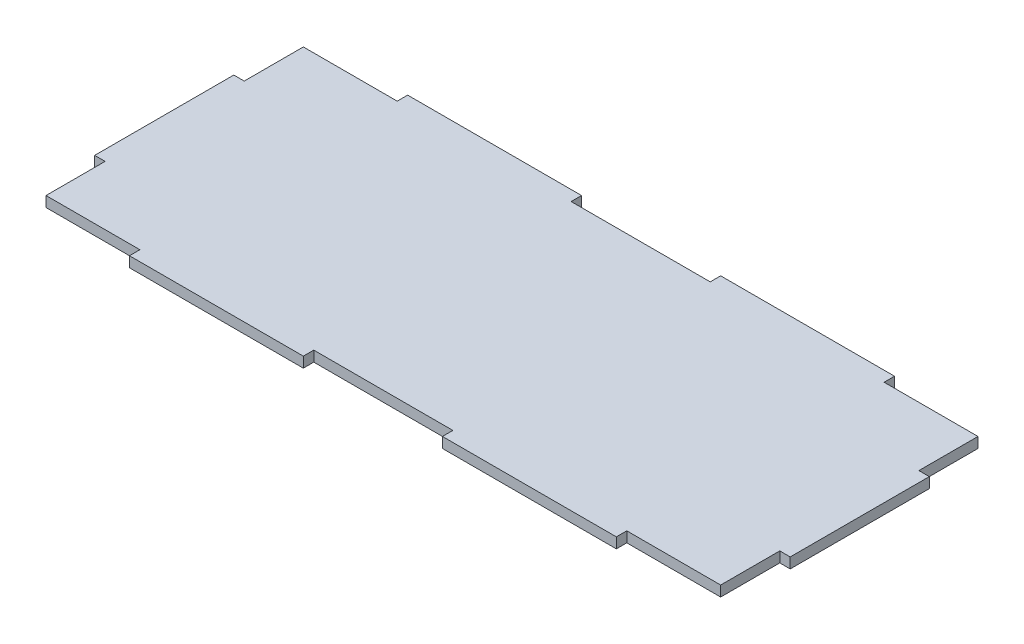
ISO-10303-21;
HEADER;
FILE_DESCRIPTION(('STEP AP214'),'2;1');
FILE_NAME('part.step','',(''),(''),'','','');
FILE_SCHEMA(('AUTOMOTIVE_DESIGN { 1 0 10303 214 1 1 1 1 }'));
ENDSEC;
DATA;
#1=APPLICATION_CONTEXT('core data for automotive mechanical design processes');
#2=APPLICATION_PROTOCOL_DEFINITION('international standard','automotive_design',2000,#1);
#3=PRODUCT_CONTEXT('',#1,'mechanical');
#4=PRODUCT('Part','Part','',(#3));
#5=PRODUCT_RELATED_PRODUCT_CATEGORY('part','',(#4));
#6=PRODUCT_DEFINITION_FORMATION('','',#4);
#7=PRODUCT_DEFINITION_CONTEXT('part definition',#1,'design');
#8=PRODUCT_DEFINITION('design','',#6,#7);
#9=PRODUCT_DEFINITION_SHAPE('','',#8);
#10=(LENGTH_UNIT() NAMED_UNIT(*) SI_UNIT(.MILLI.,.METRE.));
#11=(NAMED_UNIT(*) PLANE_ANGLE_UNIT() SI_UNIT($,.RADIAN.));
#12=(NAMED_UNIT(*) SI_UNIT($,.STERADIAN.) SOLID_ANGLE_UNIT());
#13=UNCERTAINTY_MEASURE_WITH_UNIT(LENGTH_MEASURE(1.E-05),#10,'distance_accuracy_value','');
#14=(GEOMETRIC_REPRESENTATION_CONTEXT(3) GLOBAL_UNCERTAINTY_ASSIGNED_CONTEXT((#13)) GLOBAL_UNIT_ASSIGNED_CONTEXT((#10,
#11,#12)) REPRESENTATION_CONTEXT('',''));
#15=CARTESIAN_POINT('',(0.,0.,0.));
#16=DIRECTION('',(0.,0.,1.));
#17=DIRECTION('',(1.,0.,0.));
#18=AXIS2_PLACEMENT_3D('',#15,#16,#17);
#19=CARTESIAN_POINT('',(130.946189250102,3.,-25.5131654357669));
#20=DIRECTION('',(-1.,0.,0.));
#21=DIRECTION('',(0.,0.,1.));
#22=AXIS2_PLACEMENT_3D('',#19,#20,#21);
#23=PLANE('',#22);
#24=DIRECTION('',(0.,0.,-1.));
#25=VECTOR('',#24,1.);
#26=CARTESIAN_POINT('',(130.946189250102,0.,-25.5131654357669));
#27=LINE('',#26,#25);
#28=CARTESIAN_POINT('',(130.946189250102,0.,-8.5131654357669));
#29=VERTEX_POINT('',#28);
#30=CARTESIAN_POINT('',(130.946189250102,0.,-25.5131654357669));
#31=VERTEX_POINT('',#30);
#32=EDGE_CURVE('E249',#29,#31,#27,.T.);
#33=ORIENTED_EDGE('',*,*,#32,.T.);
#34=DIRECTION('',(0.,-1.,0.));
#35=VECTOR('',#34,1.);
#36=CARTESIAN_POINT('',(130.946189250102,3.,-25.5131654357669));
#37=LINE('',#36,#35);
#38=CARTESIAN_POINT('',(130.946189250102,3.,-25.5131654357669));
#39=VERTEX_POINT('',#38);
#40=EDGE_CURVE('E11',#39,#31,#37,.T.);
#41=ORIENTED_EDGE('',*,*,#40,.F.);
#42=DIRECTION('',(0.,0.,-1.));
#43=VECTOR('',#42,1.);
#44=CARTESIAN_POINT('',(130.946189250102,3.,-25.5131654357669));
#45=LINE('',#44,#43);
#46=CARTESIAN_POINT('',(130.946189250102,3.,-8.5131654357669));
#47=VERTEX_POINT('',#46);
#48=EDGE_CURVE('E303',#47,#39,#45,.T.);
#49=ORIENTED_EDGE('',*,*,#48,.F.);
#50=DIRECTION('',(0.,-1.,0.));
#51=VECTOR('',#50,1.);
#52=CARTESIAN_POINT('',(130.946189250102,3.,-8.5131654357669));
#53=LINE('',#52,#51);
#54=EDGE_CURVE('E245',#47,#29,#53,.T.);
#55=ORIENTED_EDGE('',*,*,#54,.T.);
#56=EDGE_LOOP('',(#33,#41,#49,#55));
#57=FACE_BOUND('',#56,.T.);
#58=ADVANCED_FACE('F33',(#57),#23,.F.);
#59=CARTESIAN_POINT('',(130.946189250102,3.,-25.5131654357669));
#60=DIRECTION('',(0.,0.,1.));
#61=DIRECTION('',(1.,0.,0.));
#62=AXIS2_PLACEMENT_3D('',#59,#60,#61);
#63=PLANE('',#62);
#64=DIRECTION('',(-1.,0.,0.));
#65=VECTOR('',#64,1.);
#66=CARTESIAN_POINT('',(130.946189250102,0.,-25.5131654357669));
#67=LINE('',#66,#65);
#68=CARTESIAN_POINT('',(103.946189250102,0.,-25.5131654357669));
#69=VERTEX_POINT('',#68);
#70=EDGE_CURVE('E252',#31,#69,#67,.T.);
#71=ORIENTED_EDGE('',*,*,#70,.T.);
#72=DIRECTION('',(0.,-1.,0.));
#73=VECTOR('',#72,1.);
#74=CARTESIAN_POINT('',(103.946189250102,3.,-25.5131654357669));
#75=LINE('',#74,#73);
#76=CARTESIAN_POINT('',(103.946189250102,3.,-25.5131654357669));
#77=VERTEX_POINT('',#76);
#78=EDGE_CURVE('E41',#77,#69,#75,.T.);
#79=ORIENTED_EDGE('',*,*,#78,.F.);
#80=DIRECTION('',(-1.,0.,0.));
#81=VECTOR('',#80,1.);
#82=CARTESIAN_POINT('',(130.946189250102,3.,-25.5131654357669));
#83=LINE('',#82,#81);
#84=EDGE_CURVE('E152',#39,#77,#83,.T.);
#85=ORIENTED_EDGE('',*,*,#84,.F.);
#86=ORIENTED_EDGE('',*,*,#40,.T.);
#87=EDGE_LOOP('',(#71,#79,#85,#86));
#88=FACE_BOUND('',#87,.T.);
#89=ADVANCED_FACE('F461',(#88),#63,.F.);
#90=CARTESIAN_POINT('',(103.946189250102,3.,-28.5131654357669));
#91=DIRECTION('',(-1.,0.,0.));
#92=DIRECTION('',(0.,0.,1.));
#93=AXIS2_PLACEMENT_3D('',#90,#91,#92);
#94=PLANE('',#93);
#95=DIRECTION('',(0.,0.,-1.));
#96=VECTOR('',#95,1.);
#97=CARTESIAN_POINT('',(103.946189250102,0.,-28.5131654357669));
#98=LINE('',#97,#96);
#99=CARTESIAN_POINT('',(103.946189250102,0.,-28.5131654357669));
#100=VERTEX_POINT('',#99);
#101=EDGE_CURVE('E254',#69,#100,#98,.T.);
#102=ORIENTED_EDGE('',*,*,#101,.T.);
#103=DIRECTION('',(0.,-1.,0.));
#104=VECTOR('',#103,1.);
#105=CARTESIAN_POINT('',(103.946189250102,3.,-28.5131654357669));
#106=LINE('',#105,#104);
#107=CARTESIAN_POINT('',(103.946189250102,3.,-28.5131654357669));
#108=VERTEX_POINT('',#107);
#109=EDGE_CURVE('E370',#108,#100,#106,.T.);
#110=ORIENTED_EDGE('',*,*,#109,.F.);
#111=DIRECTION('',(0.,0.,-1.));
#112=VECTOR('',#111,1.);
#113=CARTESIAN_POINT('',(103.946189250102,3.,-28.5131654357669));
#114=LINE('',#113,#112);
#115=EDGE_CURVE('E378',#77,#108,#114,.T.);
#116=ORIENTED_EDGE('',*,*,#115,.F.);
#117=ORIENTED_EDGE('',*,*,#78,.T.);
#118=EDGE_LOOP('',(#102,#110,#116,#117));
#119=FACE_BOUND('',#118,.T.);
#120=ADVANCED_FACE('F376',(#119),#94,.F.);
#121=CARTESIAN_POINT('',(53.9461892501022,3.,-28.5131654357669));
#122=DIRECTION('',(0.,0.,1.));
#123=DIRECTION('',(1.,0.,0.));
#124=AXIS2_PLACEMENT_3D('',#121,#122,#123);
#125=PLANE('',#124);
#126=DIRECTION('',(-1.,0.,0.));
#127=VECTOR('',#126,1.);
#128=CARTESIAN_POINT('',(53.9461892501022,0.,-28.5131654357669));
#129=LINE('',#128,#127);
#130=CARTESIAN_POINT('',(53.9461892501022,0.,-28.5131654357669));
#131=VERTEX_POINT('',#130);
#132=EDGE_CURVE('E256',#100,#131,#129,.T.);
#133=ORIENTED_EDGE('',*,*,#132,.T.);
#134=DIRECTION('',(0.,-1.,0.));
#135=VECTOR('',#134,1.);
#136=CARTESIAN_POINT('',(53.9461892501022,3.,-28.5131654357669));
#137=LINE('',#136,#135);
#138=CARTESIAN_POINT('',(53.9461892501022,3.,-28.5131654357669));
#139=VERTEX_POINT('',#138);
#140=EDGE_CURVE('E367',#139,#131,#137,.T.);
#141=ORIENTED_EDGE('',*,*,#140,.F.);
#142=DIRECTION('',(-1.,0.,0.));
#143=VECTOR('',#142,1.);
#144=CARTESIAN_POINT('',(53.9461892501022,3.,-28.5131654357669));
#145=LINE('',#144,#143);
#146=EDGE_CURVE('E396',#108,#139,#145,.T.);
#147=ORIENTED_EDGE('',*,*,#146,.F.);
#148=ORIENTED_EDGE('',*,*,#109,.T.);
#149=EDGE_LOOP('',(#133,#141,#147,#148));
#150=FACE_BOUND('',#149,.T.);
#151=ADVANCED_FACE('F387',(#150),#125,.F.);
#152=CARTESIAN_POINT('',(53.9461892501022,3.,-28.5131654357669));
#153=DIRECTION('',(1.,0.,0.));
#154=DIRECTION('',(0.,0.,-1.));
#155=AXIS2_PLACEMENT_3D('',#152,#153,#154);
#156=PLANE('',#155);
#157=DIRECTION('',(0.,0.,1.));
#158=VECTOR('',#157,1.);
#159=CARTESIAN_POINT('',(53.9461892501022,0.,-28.5131654357669));
#160=LINE('',#159,#158);
#161=CARTESIAN_POINT('',(53.9461892501022,0.,-25.5131654357669));
#162=VERTEX_POINT('',#161);
#163=EDGE_CURVE('E258',#131,#162,#160,.T.);
#164=ORIENTED_EDGE('',*,*,#163,.T.);
#165=DIRECTION('',(0.,-1.,0.));
#166=VECTOR('',#165,1.);
#167=CARTESIAN_POINT('',(53.9461892501022,3.,-25.5131654357669));
#168=LINE('',#167,#166);
#169=CARTESIAN_POINT('',(53.9461892501022,3.,-25.5131654357669));
#170=VERTEX_POINT('',#169);
#171=EDGE_CURVE('E364',#170,#162,#168,.T.);
#172=ORIENTED_EDGE('',*,*,#171,.F.);
#173=DIRECTION('',(0.,0.,1.));
#174=VECTOR('',#173,1.);
#175=CARTESIAN_POINT('',(53.9461892501022,3.,-28.5131654357669));
#176=LINE('',#175,#174);
#177=EDGE_CURVE('E393',#139,#170,#176,.T.);
#178=ORIENTED_EDGE('',*,*,#177,.F.);
#179=ORIENTED_EDGE('',*,*,#140,.T.);
#180=EDGE_LOOP('',(#164,#172,#178,#179));
#181=FACE_BOUND('',#180,.T.);
#182=ADVANCED_FACE('F391',(#181),#156,.F.);
#183=CARTESIAN_POINT('',(13.9461892501022,3.,-25.5131654357669));
#184=DIRECTION('',(0.,0.,1.));
#185=DIRECTION('',(1.,0.,0.));
#186=AXIS2_PLACEMENT_3D('',#183,#184,#185);
#187=PLANE('',#186);
#188=DIRECTION('',(-1.,0.,0.));
#189=VECTOR('',#188,1.);
#190=CARTESIAN_POINT('',(13.9461892501022,0.,-25.5131654357669));
#191=LINE('',#190,#189);
#192=CARTESIAN_POINT('',(13.9461892501022,0.,-25.5131654357669));
#193=VERTEX_POINT('',#192);
#194=EDGE_CURVE('E260',#162,#193,#191,.T.);
#195=ORIENTED_EDGE('',*,*,#194,.T.);
#196=DIRECTION('',(0.,-1.,0.));
#197=VECTOR('',#196,1.);
#198=CARTESIAN_POINT('',(13.9461892501022,3.,-25.5131654357669));
#199=LINE('',#198,#197);
#200=CARTESIAN_POINT('',(13.9461892501022,3.,-25.5131654357669));
#201=VERTEX_POINT('',#200);
#202=EDGE_CURVE('E361',#201,#193,#199,.T.);
#203=ORIENTED_EDGE('',*,*,#202,.F.);
#204=DIRECTION('',(-1.,0.,0.));
#205=VECTOR('',#204,1.);
#206=CARTESIAN_POINT('',(13.9461892501022,3.,-25.5131654357669));
#207=LINE('',#206,#205);
#208=EDGE_CURVE('E395',#170,#201,#207,.T.);
#209=ORIENTED_EDGE('',*,*,#208,.F.);
#210=ORIENTED_EDGE('',*,*,#171,.T.);
#211=EDGE_LOOP('',(#195,#203,#209,#210));
#212=FACE_BOUND('',#211,.T.);
#213=ADVANCED_FACE('F474',(#212),#187,.F.);
#214=CARTESIAN_POINT('',(13.9461892501022,3.,-28.5131654357669));
#215=DIRECTION('',(-1.,0.,0.));
#216=DIRECTION('',(0.,0.,1.));
#217=AXIS2_PLACEMENT_3D('',#214,#215,#216);
#218=PLANE('',#217);
#219=DIRECTION('',(0.,0.,-1.));
#220=VECTOR('',#219,1.);
#221=CARTESIAN_POINT('',(13.9461892501022,0.,-28.5131654357669));
#222=LINE('',#221,#220);
#223=CARTESIAN_POINT('',(13.9461892501022,0.,-28.5131654357669));
#224=VERTEX_POINT('',#223);
#225=EDGE_CURVE('E262',#193,#224,#222,.T.);
#226=ORIENTED_EDGE('',*,*,#225,.T.);
#227=DIRECTION('',(0.,-1.,0.));
#228=VECTOR('',#227,1.);
#229=CARTESIAN_POINT('',(13.9461892501022,3.,-28.5131654357669));
#230=LINE('',#229,#228);
#231=CARTESIAN_POINT('',(13.9461892501022,3.,-28.5131654357669));
#232=VERTEX_POINT('',#231);
#233=EDGE_CURVE('E358',#232,#224,#230,.T.);
#234=ORIENTED_EDGE('',*,*,#233,.F.);
#235=DIRECTION('',(0.,0.,-1.));
#236=VECTOR('',#235,1.);
#237=CARTESIAN_POINT('',(13.9461892501022,3.,-28.5131654357669));
#238=LINE('',#237,#236);
#239=EDGE_CURVE('E398',#201,#232,#238,.T.);
#240=ORIENTED_EDGE('',*,*,#239,.F.);
#241=ORIENTED_EDGE('',*,*,#202,.T.);
#242=EDGE_LOOP('',(#226,#234,#240,#241));
#243=FACE_BOUND('',#242,.T.);
#244=ADVANCED_FACE('F477',(#243),#218,.F.);
#245=CARTESIAN_POINT('',(-36.0538107498978,3.,-28.5131654357669));
#246=DIRECTION('',(0.,0.,1.));
#247=DIRECTION('',(1.,0.,0.));
#248=AXIS2_PLACEMENT_3D('',#245,#246,#247);
#249=PLANE('',#248);
#250=DIRECTION('',(-1.,0.,0.));
#251=VECTOR('',#250,1.);
#252=CARTESIAN_POINT('',(-36.0538107498978,0.,-28.5131654357669));
#253=LINE('',#252,#251);
#254=CARTESIAN_POINT('',(-36.0538107498978,0.,-28.5131654357669));
#255=VERTEX_POINT('',#254);
#256=EDGE_CURVE('E264',#224,#255,#253,.T.);
#257=ORIENTED_EDGE('',*,*,#256,.T.);
#258=DIRECTION('',(0.,-1.,0.));
#259=VECTOR('',#258,1.);
#260=CARTESIAN_POINT('',(-36.0538107498978,3.,-28.5131654357669));
#261=LINE('',#260,#259);
#262=CARTESIAN_POINT('',(-36.0538107498978,3.,-28.5131654357669));
#263=VERTEX_POINT('',#262);
#264=EDGE_CURVE('E355',#263,#255,#261,.T.);
#265=ORIENTED_EDGE('',*,*,#264,.F.);
#266=DIRECTION('',(-1.,0.,0.));
#267=VECTOR('',#266,1.);
#268=CARTESIAN_POINT('',(-36.0538107498978,3.,-28.5131654357669));
#269=LINE('',#268,#267);
#270=EDGE_CURVE('E404',#232,#263,#269,.T.);
#271=ORIENTED_EDGE('',*,*,#270,.F.);
#272=ORIENTED_EDGE('',*,*,#233,.T.);
#273=EDGE_LOOP('',(#257,#265,#271,#272));
#274=FACE_BOUND('',#273,.T.);
#275=ADVANCED_FACE('F481',(#274),#249,.F.);
#276=CARTESIAN_POINT('',(-36.0538107498978,3.,-28.5131654357669));
#277=DIRECTION('',(1.,0.,0.));
#278=DIRECTION('',(0.,0.,-1.));
#279=AXIS2_PLACEMENT_3D('',#276,#277,#278);
#280=PLANE('',#279);
#281=DIRECTION('',(0.,0.,1.));
#282=VECTOR('',#281,1.);
#283=CARTESIAN_POINT('',(-36.0538107498978,0.,-28.5131654357669));
#284=LINE('',#283,#282);
#285=CARTESIAN_POINT('',(-36.0538107498978,0.,-25.5131654357669));
#286=VERTEX_POINT('',#285);
#287=EDGE_CURVE('E266',#255,#286,#284,.T.);
#288=ORIENTED_EDGE('',*,*,#287,.T.);
#289=DIRECTION('',(0.,-1.,0.));
#290=VECTOR('',#289,1.);
#291=CARTESIAN_POINT('',(-36.0538107498978,3.,-25.5131654357669));
#292=LINE('',#291,#290);
#293=CARTESIAN_POINT('',(-36.0538107498978,3.,-25.5131654357669));
#294=VERTEX_POINT('',#293);
#295=EDGE_CURVE('E352',#294,#286,#292,.T.);
#296=ORIENTED_EDGE('',*,*,#295,.F.);
#297=DIRECTION('',(0.,0.,1.));
#298=VECTOR('',#297,1.);
#299=CARTESIAN_POINT('',(-36.0538107498978,3.,-28.5131654357669));
#300=LINE('',#299,#298);
#301=EDGE_CURVE('E406',#263,#294,#300,.T.);
#302=ORIENTED_EDGE('',*,*,#301,.F.);
#303=ORIENTED_EDGE('',*,*,#264,.T.);
#304=EDGE_LOOP('',(#288,#296,#302,#303));
#305=FACE_BOUND('',#304,.T.);
#306=ADVANCED_FACE('F485',(#305),#280,.F.);
#307=CARTESIAN_POINT('',(-63.0538107498979,3.,-25.5131654357669));
#308=DIRECTION('',(0.,0.,1.));
#309=DIRECTION('',(1.,0.,0.));
#310=AXIS2_PLACEMENT_3D('',#307,#308,#309);
#311=PLANE('',#310);
#312=DIRECTION('',(-1.,0.,0.));
#313=VECTOR('',#312,1.);
#314=CARTESIAN_POINT('',(-63.0538107498979,0.,-25.5131654357669));
#315=LINE('',#314,#313);
#316=CARTESIAN_POINT('',(-63.0538107498979,0.,-25.5131654357669));
#317=VERTEX_POINT('',#316);
#318=EDGE_CURVE('E268',#286,#317,#315,.T.);
#319=ORIENTED_EDGE('',*,*,#318,.T.);
#320=DIRECTION('',(0.,-1.,0.));
#321=VECTOR('',#320,1.);
#322=CARTESIAN_POINT('',(-63.0538107498979,3.,-25.5131654357669));
#323=LINE('',#322,#321);
#324=CARTESIAN_POINT('',(-63.0538107498979,3.,-25.5131654357669));
#325=VERTEX_POINT('',#324);
#326=EDGE_CURVE('E349',#325,#317,#323,.T.);
#327=ORIENTED_EDGE('',*,*,#326,.F.);
#328=DIRECTION('',(-1.,0.,0.));
#329=VECTOR('',#328,1.);
#330=CARTESIAN_POINT('',(-63.0538107498979,3.,-25.5131654357669));
#331=LINE('',#330,#329);
#332=EDGE_CURVE('E408',#294,#325,#331,.T.);
#333=ORIENTED_EDGE('',*,*,#332,.F.);
#334=ORIENTED_EDGE('',*,*,#295,.T.);
#335=EDGE_LOOP('',(#319,#327,#333,#334));
#336=FACE_BOUND('',#335,.T.);
#337=ADVANCED_FACE('F489',(#336),#311,.F.);
#338=CARTESIAN_POINT('',(-63.0538107498979,3.,-25.5131654357669));
#339=DIRECTION('',(1.,0.,0.));
#340=DIRECTION('',(0.,0.,-1.));
#341=AXIS2_PLACEMENT_3D('',#338,#339,#340);
#342=PLANE('',#341);
#343=DIRECTION('',(0.,0.,1.));
#344=VECTOR('',#343,1.);
#345=CARTESIAN_POINT('',(-63.0538107498979,0.,-25.5131654357669));
#346=LINE('',#345,#344);
#347=CARTESIAN_POINT('',(-63.0538107498979,0.,-8.51316543576689));
#348=VERTEX_POINT('',#347);
#349=EDGE_CURVE('E270',#317,#348,#346,.T.);
#350=ORIENTED_EDGE('',*,*,#349,.T.);
#351=DIRECTION('',(0.,-1.,0.));
#352=VECTOR('',#351,1.);
#353=CARTESIAN_POINT('',(-63.0538107498979,3.,-8.51316543576689));
#354=LINE('',#353,#352);
#355=CARTESIAN_POINT('',(-63.0538107498979,3.,-8.51316543576689));
#356=VERTEX_POINT('',#355);
#357=EDGE_CURVE('E346',#356,#348,#354,.T.);
#358=ORIENTED_EDGE('',*,*,#357,.F.);
#359=DIRECTION('',(0.,0.,1.));
#360=VECTOR('',#359,1.);
#361=CARTESIAN_POINT('',(-63.0538107498979,3.,-25.5131654357669));
#362=LINE('',#361,#360);
#363=EDGE_CURVE('E410',#325,#356,#362,.T.);
#364=ORIENTED_EDGE('',*,*,#363,.F.);
#365=ORIENTED_EDGE('',*,*,#326,.T.);
#366=EDGE_LOOP('',(#350,#358,#364,#365));
#367=FACE_BOUND('',#366,.T.);
#368=ADVANCED_FACE('F493',(#367),#342,.F.);
#369=CARTESIAN_POINT('',(-66.0538107498979,3.,-8.51316543576689));
#370=DIRECTION('',(0.,0.,1.));
#371=DIRECTION('',(1.,0.,0.));
#372=AXIS2_PLACEMENT_3D('',#369,#370,#371);
#373=PLANE('',#372);
#374=DIRECTION('',(-1.,0.,0.));
#375=VECTOR('',#374,1.);
#376=CARTESIAN_POINT('',(-66.0538107498979,0.,-8.51316543576689));
#377=LINE('',#376,#375);
#378=CARTESIAN_POINT('',(-66.0538107498979,0.,-8.51316543576689));
#379=VERTEX_POINT('',#378);
#380=EDGE_CURVE('E272',#348,#379,#377,.T.);
#381=ORIENTED_EDGE('',*,*,#380,.T.);
#382=DIRECTION('',(0.,-1.,0.));
#383=VECTOR('',#382,1.);
#384=CARTESIAN_POINT('',(-66.0538107498979,3.,-8.51316543576689));
#385=LINE('',#384,#383);
#386=CARTESIAN_POINT('',(-66.0538107498979,3.,-8.51316543576689));
#387=VERTEX_POINT('',#386);
#388=EDGE_CURVE('E343',#387,#379,#385,.T.);
#389=ORIENTED_EDGE('',*,*,#388,.F.);
#390=DIRECTION('',(-1.,0.,0.));
#391=VECTOR('',#390,1.);
#392=CARTESIAN_POINT('',(-66.0538107498979,3.,-8.51316543576689));
#393=LINE('',#392,#391);
#394=EDGE_CURVE('E412',#356,#387,#393,.T.);
#395=ORIENTED_EDGE('',*,*,#394,.F.);
#396=ORIENTED_EDGE('',*,*,#357,.T.);
#397=EDGE_LOOP('',(#381,#389,#395,#396));
#398=FACE_BOUND('',#397,.T.);
#399=ADVANCED_FACE('F497',(#398),#373,.F.);
#400=CARTESIAN_POINT('',(-66.0538107498979,3.,-8.51316543576689));
#401=DIRECTION('',(1.,0.,0.));
#402=DIRECTION('',(0.,0.,-1.));
#403=AXIS2_PLACEMENT_3D('',#400,#401,#402);
#404=PLANE('',#403);
#405=DIRECTION('',(0.,0.,1.));
#406=VECTOR('',#405,1.);
#407=CARTESIAN_POINT('',(-66.0538107498979,0.,-8.51316543576689));
#408=LINE('',#407,#406);
#409=CARTESIAN_POINT('',(-66.0538107498978,0.,31.4868345642331));
#410=VERTEX_POINT('',#409);
#411=EDGE_CURVE('E274',#379,#410,#408,.T.);
#412=ORIENTED_EDGE('',*,*,#411,.T.);
#413=DIRECTION('',(0.,-1.,0.));
#414=VECTOR('',#413,1.);
#415=CARTESIAN_POINT('',(-66.0538107498978,3.,31.4868345642331));
#416=LINE('',#415,#414);
#417=CARTESIAN_POINT('',(-66.0538107498978,3.,31.4868345642331));
#418=VERTEX_POINT('',#417);
#419=EDGE_CURVE('E340',#418,#410,#416,.T.);
#420=ORIENTED_EDGE('',*,*,#419,.F.);
#421=DIRECTION('',(0.,0.,1.));
#422=VECTOR('',#421,1.);
#423=CARTESIAN_POINT('',(-66.0538107498979,3.,-8.51316543576689));
#424=LINE('',#423,#422);
#425=EDGE_CURVE('E414',#387,#418,#424,.T.);
#426=ORIENTED_EDGE('',*,*,#425,.F.);
#427=ORIENTED_EDGE('',*,*,#388,.T.);
#428=EDGE_LOOP('',(#412,#420,#426,#427));
#429=FACE_BOUND('',#428,.T.);
#430=ADVANCED_FACE('F501',(#429),#404,.F.);
#431=CARTESIAN_POINT('',(-66.0538107498978,3.,31.4868345642331));
#432=DIRECTION('',(0.,0.,-1.));
#433=DIRECTION('',(-1.,0.,0.));
#434=AXIS2_PLACEMENT_3D('',#431,#432,#433);
#435=PLANE('',#434);
#436=DIRECTION('',(1.,0.,0.));
#437=VECTOR('',#436,1.);
#438=CARTESIAN_POINT('',(-66.0538107498978,0.,31.4868345642331));
#439=LINE('',#438,#437);
#440=CARTESIAN_POINT('',(-63.0538107498979,0.,31.4868345642331));
#441=VERTEX_POINT('',#440);
#442=EDGE_CURVE('E276',#410,#441,#439,.T.);
#443=ORIENTED_EDGE('',*,*,#442,.T.);
#444=DIRECTION('',(0.,-1.,0.));
#445=VECTOR('',#444,1.);
#446=CARTESIAN_POINT('',(-63.0538107498979,3.,31.4868345642331));
#447=LINE('',#446,#445);
#448=CARTESIAN_POINT('',(-63.0538107498979,3.,31.4868345642331));
#449=VERTEX_POINT('',#448);
#450=EDGE_CURVE('E337',#449,#441,#447,.T.);
#451=ORIENTED_EDGE('',*,*,#450,.F.);
#452=DIRECTION('',(1.,0.,0.));
#453=VECTOR('',#452,1.);
#454=CARTESIAN_POINT('',(-66.0538107498978,3.,31.4868345642331));
#455=LINE('',#454,#453);
#456=EDGE_CURVE('E416',#418,#449,#455,.T.);
#457=ORIENTED_EDGE('',*,*,#456,.F.);
#458=ORIENTED_EDGE('',*,*,#419,.T.);
#459=EDGE_LOOP('',(#443,#451,#457,#458));
#460=FACE_BOUND('',#459,.T.);
#461=ADVANCED_FACE('F505',(#460),#435,.F.);
#462=CARTESIAN_POINT('',(-63.0538107498979,3.,48.4868345642331));
#463=DIRECTION('',(1.,0.,0.));
#464=DIRECTION('',(0.,0.,-1.));
#465=AXIS2_PLACEMENT_3D('',#462,#463,#464);
#466=PLANE('',#465);
#467=DIRECTION('',(0.,0.,1.));
#468=VECTOR('',#467,1.);
#469=CARTESIAN_POINT('',(-63.0538107498979,0.,48.4868345642331));
#470=LINE('',#469,#468);
#471=CARTESIAN_POINT('',(-63.0538107498979,0.,48.4868345642331));
#472=VERTEX_POINT('',#471);
#473=EDGE_CURVE('E278',#441,#472,#470,.T.);
#474=ORIENTED_EDGE('',*,*,#473,.T.);
#475=DIRECTION('',(0.,-1.,0.));
#476=VECTOR('',#475,1.);
#477=CARTESIAN_POINT('',(-63.0538107498979,3.,48.4868345642331));
#478=LINE('',#477,#476);
#479=CARTESIAN_POINT('',(-63.0538107498979,3.,48.4868345642331));
#480=VERTEX_POINT('',#479);
#481=EDGE_CURVE('E334',#480,#472,#478,.T.);
#482=ORIENTED_EDGE('',*,*,#481,.F.);
#483=DIRECTION('',(0.,0.,1.));
#484=VECTOR('',#483,1.);
#485=CARTESIAN_POINT('',(-63.0538107498979,3.,48.4868345642331));
#486=LINE('',#485,#484);
#487=EDGE_CURVE('E418',#449,#480,#486,.T.);
#488=ORIENTED_EDGE('',*,*,#487,.F.);
#489=ORIENTED_EDGE('',*,*,#450,.T.);
#490=EDGE_LOOP('',(#474,#482,#488,#489));
#491=FACE_BOUND('',#490,.T.);
#492=ADVANCED_FACE('F509',(#491),#466,.F.);
#493=CARTESIAN_POINT('',(-63.0538107498979,3.,48.4868345642331));
#494=DIRECTION('',(0.,0.,-1.));
#495=DIRECTION('',(-1.,0.,0.));
#496=AXIS2_PLACEMENT_3D('',#493,#494,#495);
#497=PLANE('',#496);
#498=DIRECTION('',(1.,0.,0.));
#499=VECTOR('',#498,1.);
#500=CARTESIAN_POINT('',(-63.0538107498979,0.,48.4868345642331));
#501=LINE('',#500,#499);
#502=CARTESIAN_POINT('',(-36.0538107498978,0.,48.4868345642331));
#503=VERTEX_POINT('',#502);
#504=EDGE_CURVE('E280',#472,#503,#501,.T.);
#505=ORIENTED_EDGE('',*,*,#504,.T.);
#506=DIRECTION('',(0.,-1.,0.));
#507=VECTOR('',#506,1.);
#508=CARTESIAN_POINT('',(-36.0538107498978,3.,48.4868345642331));
#509=LINE('',#508,#507);
#510=CARTESIAN_POINT('',(-36.0538107498978,3.,48.4868345642331));
#511=VERTEX_POINT('',#510);
#512=EDGE_CURVE('E331',#511,#503,#509,.T.);
#513=ORIENTED_EDGE('',*,*,#512,.F.);
#514=DIRECTION('',(1.,0.,0.));
#515=VECTOR('',#514,1.);
#516=CARTESIAN_POINT('',(-63.0538107498979,3.,48.4868345642331));
#517=LINE('',#516,#515);
#518=EDGE_CURVE('E420',#480,#511,#517,.T.);
#519=ORIENTED_EDGE('',*,*,#518,.F.);
#520=ORIENTED_EDGE('',*,*,#481,.T.);
#521=EDGE_LOOP('',(#505,#513,#519,#520));
#522=FACE_BOUND('',#521,.T.);
#523=ADVANCED_FACE('F513',(#522),#497,.F.);
#524=CARTESIAN_POINT('',(-36.0538107498978,3.,51.4868345642331));
#525=DIRECTION('',(1.,0.,0.));
#526=DIRECTION('',(0.,0.,-1.));
#527=AXIS2_PLACEMENT_3D('',#524,#525,#526);
#528=PLANE('',#527);
#529=DIRECTION('',(0.,0.,1.));
#530=VECTOR('',#529,1.);
#531=CARTESIAN_POINT('',(-36.0538107498978,0.,51.4868345642331));
#532=LINE('',#531,#530);
#533=CARTESIAN_POINT('',(-36.0538107498978,0.,51.4868345642331));
#534=VERTEX_POINT('',#533);
#535=EDGE_CURVE('E282',#503,#534,#532,.T.);
#536=ORIENTED_EDGE('',*,*,#535,.T.);
#537=DIRECTION('',(0.,-1.,0.));
#538=VECTOR('',#537,1.);
#539=CARTESIAN_POINT('',(-36.0538107498978,3.,51.4868345642331));
#540=LINE('',#539,#538);
#541=CARTESIAN_POINT('',(-36.0538107498978,3.,51.4868345642331));
#542=VERTEX_POINT('',#541);
#543=EDGE_CURVE('E328',#542,#534,#540,.T.);
#544=ORIENTED_EDGE('',*,*,#543,.F.);
#545=DIRECTION('',(0.,0.,1.));
#546=VECTOR('',#545,1.);
#547=CARTESIAN_POINT('',(-36.0538107498978,3.,51.4868345642331));
#548=LINE('',#547,#546);
#549=EDGE_CURVE('E422',#511,#542,#548,.T.);
#550=ORIENTED_EDGE('',*,*,#549,.F.);
#551=ORIENTED_EDGE('',*,*,#512,.T.);
#552=EDGE_LOOP('',(#536,#544,#550,#551));
#553=FACE_BOUND('',#552,.T.);
#554=ADVANCED_FACE('F517',(#553),#528,.F.);
#555=CARTESIAN_POINT('',(-36.0538107498978,3.,51.4868345642331));
#556=DIRECTION('',(0.,0.,-1.));
#557=DIRECTION('',(-1.,0.,0.));
#558=AXIS2_PLACEMENT_3D('',#555,#556,#557);
#559=PLANE('',#558);
#560=DIRECTION('',(1.,0.,0.));
#561=VECTOR('',#560,1.);
#562=CARTESIAN_POINT('',(-36.0538107498978,0.,51.4868345642331));
#563=LINE('',#562,#561);
#564=CARTESIAN_POINT('',(13.9461892501022,0.,51.4868345642331));
#565=VERTEX_POINT('',#564);
#566=EDGE_CURVE('E284',#534,#565,#563,.T.);
#567=ORIENTED_EDGE('',*,*,#566,.T.);
#568=DIRECTION('',(0.,-1.,0.));
#569=VECTOR('',#568,1.);
#570=CARTESIAN_POINT('',(13.9461892501022,3.,51.4868345642331));
#571=LINE('',#570,#569);
#572=CARTESIAN_POINT('',(13.9461892501022,3.,51.4868345642331));
#573=VERTEX_POINT('',#572);
#574=EDGE_CURVE('E325',#573,#565,#571,.T.);
#575=ORIENTED_EDGE('',*,*,#574,.F.);
#576=DIRECTION('',(1.,0.,0.));
#577=VECTOR('',#576,1.);
#578=CARTESIAN_POINT('',(-36.0538107498978,3.,51.4868345642331));
#579=LINE('',#578,#577);
#580=EDGE_CURVE('E424',#542,#573,#579,.T.);
#581=ORIENTED_EDGE('',*,*,#580,.F.);
#582=ORIENTED_EDGE('',*,*,#543,.T.);
#583=EDGE_LOOP('',(#567,#575,#581,#582));
#584=FACE_BOUND('',#583,.T.);
#585=ADVANCED_FACE('F521',(#584),#559,.F.);
#586=CARTESIAN_POINT('',(13.9461892501022,3.,51.4868345642331));
#587=DIRECTION('',(-1.,0.,0.));
#588=DIRECTION('',(0.,0.,1.));
#589=AXIS2_PLACEMENT_3D('',#586,#587,#588);
#590=PLANE('',#589);
#591=DIRECTION('',(0.,0.,-1.));
#592=VECTOR('',#591,1.);
#593=CARTESIAN_POINT('',(13.9461892501022,0.,51.4868345642331));
#594=LINE('',#593,#592);
#595=CARTESIAN_POINT('',(13.9461892501022,0.,48.4868345642331));
#596=VERTEX_POINT('',#595);
#597=EDGE_CURVE('E286',#565,#596,#594,.T.);
#598=ORIENTED_EDGE('',*,*,#597,.T.);
#599=DIRECTION('',(0.,-1.,0.));
#600=VECTOR('',#599,1.);
#601=CARTESIAN_POINT('',(13.9461892501022,3.,48.4868345642331));
#602=LINE('',#601,#600);
#603=CARTESIAN_POINT('',(13.9461892501022,3.,48.4868345642331));
#604=VERTEX_POINT('',#603);
#605=EDGE_CURVE('E322',#604,#596,#602,.T.);
#606=ORIENTED_EDGE('',*,*,#605,.F.);
#607=DIRECTION('',(0.,0.,-1.));
#608=VECTOR('',#607,1.);
#609=CARTESIAN_POINT('',(13.9461892501022,3.,51.4868345642331));
#610=LINE('',#609,#608);
#611=EDGE_CURVE('E426',#573,#604,#610,.T.);
#612=ORIENTED_EDGE('',*,*,#611,.F.);
#613=ORIENTED_EDGE('',*,*,#574,.T.);
#614=EDGE_LOOP('',(#598,#606,#612,#613));
#615=FACE_BOUND('',#614,.T.);
#616=ADVANCED_FACE('F525',(#615),#590,.F.);
#617=CARTESIAN_POINT('',(13.9461892501022,3.,48.4868345642331));
#618=DIRECTION('',(0.,0.,-1.));
#619=DIRECTION('',(-1.,0.,0.));
#620=AXIS2_PLACEMENT_3D('',#617,#618,#619);
#621=PLANE('',#620);
#622=DIRECTION('',(1.,0.,0.));
#623=VECTOR('',#622,1.);
#624=CARTESIAN_POINT('',(13.9461892501022,0.,48.4868345642331));
#625=LINE('',#624,#623);
#626=CARTESIAN_POINT('',(53.9461892501022,0.,48.4868345642331));
#627=VERTEX_POINT('',#626);
#628=EDGE_CURVE('E288',#596,#627,#625,.T.);
#629=ORIENTED_EDGE('',*,*,#628,.T.);
#630=DIRECTION('',(0.,-1.,0.));
#631=VECTOR('',#630,1.);
#632=CARTESIAN_POINT('',(53.9461892501022,3.,48.4868345642331));
#633=LINE('',#632,#631);
#634=CARTESIAN_POINT('',(53.9461892501022,3.,48.4868345642331));
#635=VERTEX_POINT('',#634);
#636=EDGE_CURVE('E319',#635,#627,#633,.T.);
#637=ORIENTED_EDGE('',*,*,#636,.F.);
#638=DIRECTION('',(1.,0.,0.));
#639=VECTOR('',#638,1.);
#640=CARTESIAN_POINT('',(13.9461892501022,3.,48.4868345642331));
#641=LINE('',#640,#639);
#642=EDGE_CURVE('E428',#604,#635,#641,.T.);
#643=ORIENTED_EDGE('',*,*,#642,.F.);
#644=ORIENTED_EDGE('',*,*,#605,.T.);
#645=EDGE_LOOP('',(#629,#637,#643,#644));
#646=FACE_BOUND('',#645,.T.);
#647=ADVANCED_FACE('F529',(#646),#621,.F.);
#648=CARTESIAN_POINT('',(53.9461892501022,3.,51.4868345642331));
#649=DIRECTION('',(1.,0.,0.));
#650=DIRECTION('',(0.,0.,-1.));
#651=AXIS2_PLACEMENT_3D('',#648,#649,#650);
#652=PLANE('',#651);
#653=DIRECTION('',(0.,0.,1.));
#654=VECTOR('',#653,1.);
#655=CARTESIAN_POINT('',(53.9461892501022,0.,51.4868345642331));
#656=LINE('',#655,#654);
#657=CARTESIAN_POINT('',(53.9461892501022,0.,51.4868345642331));
#658=VERTEX_POINT('',#657);
#659=EDGE_CURVE('E290',#627,#658,#656,.T.);
#660=ORIENTED_EDGE('',*,*,#659,.T.);
#661=DIRECTION('',(0.,-1.,0.));
#662=VECTOR('',#661,1.);
#663=CARTESIAN_POINT('',(53.9461892501022,3.,51.4868345642331));
#664=LINE('',#663,#662);
#665=CARTESIAN_POINT('',(53.9461892501022,3.,51.4868345642331));
#666=VERTEX_POINT('',#665);
#667=EDGE_CURVE('E316',#666,#658,#664,.T.);
#668=ORIENTED_EDGE('',*,*,#667,.F.);
#669=DIRECTION('',(0.,0.,1.));
#670=VECTOR('',#669,1.);
#671=CARTESIAN_POINT('',(53.9461892501022,3.,51.4868345642331));
#672=LINE('',#671,#670);
#673=EDGE_CURVE('E430',#635,#666,#672,.T.);
#674=ORIENTED_EDGE('',*,*,#673,.F.);
#675=ORIENTED_EDGE('',*,*,#636,.T.);
#676=EDGE_LOOP('',(#660,#668,#674,#675));
#677=FACE_BOUND('',#676,.T.);
#678=ADVANCED_FACE('F533',(#677),#652,.F.);
#679=CARTESIAN_POINT('',(53.9461892501022,3.,51.4868345642331));
#680=DIRECTION('',(0.,0.,-1.));
#681=DIRECTION('',(-1.,0.,0.));
#682=AXIS2_PLACEMENT_3D('',#679,#680,#681);
#683=PLANE('',#682);
#684=DIRECTION('',(1.,0.,0.));
#685=VECTOR('',#684,1.);
#686=CARTESIAN_POINT('',(53.9461892501022,0.,51.4868345642331));
#687=LINE('',#686,#685);
#688=CARTESIAN_POINT('',(103.946189250102,0.,51.4868345642331));
#689=VERTEX_POINT('',#688);
#690=EDGE_CURVE('E292',#658,#689,#687,.T.);
#691=ORIENTED_EDGE('',*,*,#690,.T.);
#692=DIRECTION('',(0.,-1.,0.));
#693=VECTOR('',#692,1.);
#694=CARTESIAN_POINT('',(103.946189250102,3.,51.4868345642331));
#695=LINE('',#694,#693);
#696=CARTESIAN_POINT('',(103.946189250102,3.,51.4868345642331));
#697=VERTEX_POINT('',#696);
#698=EDGE_CURVE('E313',#697,#689,#695,.T.);
#699=ORIENTED_EDGE('',*,*,#698,.F.);
#700=DIRECTION('',(1.,0.,0.));
#701=VECTOR('',#700,1.);
#702=CARTESIAN_POINT('',(53.9461892501022,3.,51.4868345642331));
#703=LINE('',#702,#701);
#704=EDGE_CURVE('E432',#666,#697,#703,.T.);
#705=ORIENTED_EDGE('',*,*,#704,.F.);
#706=ORIENTED_EDGE('',*,*,#667,.T.);
#707=EDGE_LOOP('',(#691,#699,#705,#706));
#708=FACE_BOUND('',#707,.T.);
#709=ADVANCED_FACE('F537',(#708),#683,.F.);
#710=CARTESIAN_POINT('',(103.946189250102,3.,51.4868345642331));
#711=DIRECTION('',(-1.,0.,0.));
#712=DIRECTION('',(0.,0.,1.));
#713=AXIS2_PLACEMENT_3D('',#710,#711,#712);
#714=PLANE('',#713);
#715=DIRECTION('',(0.,0.,-1.));
#716=VECTOR('',#715,1.);
#717=CARTESIAN_POINT('',(103.946189250102,0.,51.4868345642331));
#718=LINE('',#717,#716);
#719=CARTESIAN_POINT('',(103.946189250102,0.,48.4868345642331));
#720=VERTEX_POINT('',#719);
#721=EDGE_CURVE('E294',#689,#720,#718,.T.);
#722=ORIENTED_EDGE('',*,*,#721,.T.);
#723=DIRECTION('',(0.,-1.,0.));
#724=VECTOR('',#723,1.);
#725=CARTESIAN_POINT('',(103.946189250102,3.,48.4868345642331));
#726=LINE('',#725,#724);
#727=CARTESIAN_POINT('',(103.946189250102,3.,48.4868345642331));
#728=VERTEX_POINT('',#727);
#729=EDGE_CURVE('E310',#728,#720,#726,.T.);
#730=ORIENTED_EDGE('',*,*,#729,.F.);
#731=DIRECTION('',(0.,0.,-1.));
#732=VECTOR('',#731,1.);
#733=CARTESIAN_POINT('',(103.946189250102,3.,51.4868345642331));
#734=LINE('',#733,#732);
#735=EDGE_CURVE('E434',#697,#728,#734,.T.);
#736=ORIENTED_EDGE('',*,*,#735,.F.);
#737=ORIENTED_EDGE('',*,*,#698,.T.);
#738=EDGE_LOOP('',(#722,#730,#736,#737));
#739=FACE_BOUND('',#738,.T.);
#740=ADVANCED_FACE('F541',(#739),#714,.F.);
#741=CARTESIAN_POINT('',(130.946189250102,3.,48.4868345642331));
#742=DIRECTION('',(0.,0.,-1.));
#743=DIRECTION('',(-1.,0.,0.));
#744=AXIS2_PLACEMENT_3D('',#741,#742,#743);
#745=PLANE('',#744);
#746=DIRECTION('',(1.,0.,0.));
#747=VECTOR('',#746,1.);
#748=CARTESIAN_POINT('',(130.946189250102,0.,48.4868345642331));
#749=LINE('',#748,#747);
#750=CARTESIAN_POINT('',(130.946189250102,0.,48.4868345642331));
#751=VERTEX_POINT('',#750);
#752=EDGE_CURVE('E296',#720,#751,#749,.T.);
#753=ORIENTED_EDGE('',*,*,#752,.T.);
#754=DIRECTION('',(0.,-1.,0.));
#755=VECTOR('',#754,1.);
#756=CARTESIAN_POINT('',(130.946189250102,3.,48.4868345642331));
#757=LINE('',#756,#755);
#758=CARTESIAN_POINT('',(130.946189250102,3.,48.4868345642331));
#759=VERTEX_POINT('',#758);
#760=EDGE_CURVE('E307',#759,#751,#757,.T.);
#761=ORIENTED_EDGE('',*,*,#760,.F.);
#762=DIRECTION('',(1.,0.,0.));
#763=VECTOR('',#762,1.);
#764=CARTESIAN_POINT('',(130.946189250102,3.,48.4868345642331));
#765=LINE('',#764,#763);
#766=EDGE_CURVE('E436',#728,#759,#765,.T.);
#767=ORIENTED_EDGE('',*,*,#766,.F.);
#768=ORIENTED_EDGE('',*,*,#729,.T.);
#769=EDGE_LOOP('',(#753,#761,#767,#768));
#770=FACE_BOUND('',#769,.T.);
#771=ADVANCED_FACE('F442',(#770),#745,.F.);
#772=CARTESIAN_POINT('',(130.946189250102,3.,48.4868345642331));
#773=DIRECTION('',(-1.,0.,0.));
#774=DIRECTION('',(0.,0.,1.));
#775=AXIS2_PLACEMENT_3D('',#772,#773,#774);
#776=PLANE('',#775);
#777=DIRECTION('',(0.,0.,-1.));
#778=VECTOR('',#777,1.);
#779=CARTESIAN_POINT('',(130.946189250102,0.,48.4868345642331));
#780=LINE('',#779,#778);
#781=CARTESIAN_POINT('',(130.946189250102,0.,31.4868345642331));
#782=VERTEX_POINT('',#781);
#783=EDGE_CURVE('E298',#751,#782,#780,.T.);
#784=ORIENTED_EDGE('',*,*,#783,.T.);
#785=DIRECTION('',(0.,-1.,0.));
#786=VECTOR('',#785,1.);
#787=CARTESIAN_POINT('',(130.946189250102,3.,31.4868345642331));
#788=LINE('',#787,#786);
#789=CARTESIAN_POINT('',(130.946189250102,3.,31.4868345642331));
#790=VERTEX_POINT('',#789);
#791=EDGE_CURVE('E240',#790,#782,#788,.T.);
#792=ORIENTED_EDGE('',*,*,#791,.F.);
#793=DIRECTION('',(0.,0.,-1.));
#794=VECTOR('',#793,1.);
#795=CARTESIAN_POINT('',(130.946189250102,3.,48.4868345642331));
#796=LINE('',#795,#794);
#797=EDGE_CURVE('E231',#759,#790,#796,.T.);
#798=ORIENTED_EDGE('',*,*,#797,.F.);
#799=ORIENTED_EDGE('',*,*,#760,.T.);
#800=EDGE_LOOP('',(#784,#792,#798,#799));
#801=FACE_BOUND('',#800,.T.);
#802=ADVANCED_FACE('F446',(#801),#776,.F.);
#803=CARTESIAN_POINT('',(133.946189250102,3.,31.4868345642331));
#804=DIRECTION('',(0.,0.,-1.));
#805=DIRECTION('',(-1.,0.,0.));
#806=AXIS2_PLACEMENT_3D('',#803,#804,#805);
#807=PLANE('',#806);
#808=DIRECTION('',(1.,0.,0.));
#809=VECTOR('',#808,1.);
#810=CARTESIAN_POINT('',(133.946189250102,0.,31.4868345642331));
#811=LINE('',#810,#809);
#812=CARTESIAN_POINT('',(133.946189250102,0.,31.4868345642331));
#813=VERTEX_POINT('',#812);
#814=EDGE_CURVE('E239',#782,#813,#811,.T.);
#815=ORIENTED_EDGE('',*,*,#814,.T.);
#816=DIRECTION('',(0.,-1.,0.));
#817=VECTOR('',#816,1.);
#818=CARTESIAN_POINT('',(133.946189250102,3.,31.4868345642331));
#819=LINE('',#818,#817);
#820=CARTESIAN_POINT('',(133.946189250102,3.,31.4868345642331));
#821=VERTEX_POINT('',#820);
#822=EDGE_CURVE('E236',#821,#813,#819,.T.);
#823=ORIENTED_EDGE('',*,*,#822,.F.);
#824=DIRECTION('',(1.,0.,0.));
#825=VECTOR('',#824,1.);
#826=CARTESIAN_POINT('',(133.946189250102,3.,31.4868345642331));
#827=LINE('',#826,#825);
#828=EDGE_CURVE('E225',#790,#821,#827,.T.);
#829=ORIENTED_EDGE('',*,*,#828,.F.);
#830=ORIENTED_EDGE('',*,*,#791,.T.);
#831=EDGE_LOOP('',(#815,#823,#829,#830));
#832=FACE_BOUND('',#831,.T.);
#833=ADVANCED_FACE('F237',(#832),#807,.F.);
#834=CARTESIAN_POINT('',(133.946189250102,3.,-8.5131654357669));
#835=DIRECTION('',(-1.,0.,0.));
#836=DIRECTION('',(0.,0.,1.));
#837=AXIS2_PLACEMENT_3D('',#834,#835,#836);
#838=PLANE('',#837);
#839=DIRECTION('',(0.,0.,-1.));
#840=VECTOR('',#839,1.);
#841=CARTESIAN_POINT('',(133.946189250102,0.,-8.5131654357669));
#842=LINE('',#841,#840);
#843=CARTESIAN_POINT('',(133.946189250102,0.,-8.5131654357669));
#844=VERTEX_POINT('',#843);
#845=EDGE_CURVE('E138',#813,#844,#842,.T.);
#846=ORIENTED_EDGE('',*,*,#845,.T.);
#847=DIRECTION('',(0.,-1.,0.));
#848=VECTOR('',#847,1.);
#849=CARTESIAN_POINT('',(133.946189250102,3.,-8.5131654357669));
#850=LINE('',#849,#848);
#851=CARTESIAN_POINT('',(133.946189250102,3.,-8.5131654357669));
#852=VERTEX_POINT('',#851);
#853=EDGE_CURVE('E241',#852,#844,#850,.T.);
#854=ORIENTED_EDGE('',*,*,#853,.F.);
#855=DIRECTION('',(0.,0.,-1.));
#856=VECTOR('',#855,1.);
#857=CARTESIAN_POINT('',(133.946189250102,3.,-8.5131654357669));
#858=LINE('',#857,#856);
#859=EDGE_CURVE('E229',#821,#852,#858,.T.);
#860=ORIENTED_EDGE('',*,*,#859,.F.);
#861=ORIENTED_EDGE('',*,*,#822,.T.);
#862=EDGE_LOOP('',(#846,#854,#860,#861));
#863=FACE_BOUND('',#862,.T.);
#864=ADVANCED_FACE('F243',(#863),#838,.F.);
#865=CARTESIAN_POINT('',(133.946189250102,3.,-8.5131654357669));
#866=DIRECTION('',(0.,0.,1.));
#867=DIRECTION('',(1.,0.,0.));
#868=AXIS2_PLACEMENT_3D('',#865,#866,#867);
#869=PLANE('',#868);
#870=DIRECTION('',(-1.,0.,0.));
#871=VECTOR('',#870,1.);
#872=CARTESIAN_POINT('',(133.946189250102,0.,-8.5131654357669));
#873=LINE('',#872,#871);
#874=EDGE_CURVE('E144',#844,#29,#873,.T.);
#875=ORIENTED_EDGE('',*,*,#874,.T.);
#876=ORIENTED_EDGE('',*,*,#54,.F.);
#877=DIRECTION('',(-1.,0.,0.));
#878=VECTOR('',#877,1.);
#879=CARTESIAN_POINT('',(133.946189250102,3.,-8.5131654357669));
#880=LINE('',#879,#878);
#881=EDGE_CURVE('E49',#852,#47,#880,.T.);
#882=ORIENTED_EDGE('',*,*,#881,.F.);
#883=ORIENTED_EDGE('',*,*,#853,.T.);
#884=EDGE_LOOP('',(#875,#876,#882,#883));
#885=FACE_BOUND('',#884,.T.);
#886=ADVANCED_FACE('F450',(#885),#869,.F.);
#887=CARTESIAN_POINT('',(0.,3.,0.));
#888=DIRECTION('',(0.,-1.,0.));
#889=DIRECTION('',(0.,0.,-1.));
#890=AXIS2_PLACEMENT_3D('',#887,#888,#889);
#891=PLANE('',#890);
#892=ORIENTED_EDGE('',*,*,#48,.T.);
#893=ORIENTED_EDGE('',*,*,#84,.T.);
#894=ORIENTED_EDGE('',*,*,#115,.T.);
#895=ORIENTED_EDGE('',*,*,#146,.T.);
#896=ORIENTED_EDGE('',*,*,#177,.T.);
#897=ORIENTED_EDGE('',*,*,#208,.T.);
#898=ORIENTED_EDGE('',*,*,#239,.T.);
#899=ORIENTED_EDGE('',*,*,#270,.T.);
#900=ORIENTED_EDGE('',*,*,#301,.T.);
#901=ORIENTED_EDGE('',*,*,#332,.T.);
#902=ORIENTED_EDGE('',*,*,#363,.T.);
#903=ORIENTED_EDGE('',*,*,#394,.T.);
#904=ORIENTED_EDGE('',*,*,#425,.T.);
#905=ORIENTED_EDGE('',*,*,#456,.T.);
#906=ORIENTED_EDGE('',*,*,#487,.T.);
#907=ORIENTED_EDGE('',*,*,#518,.T.);
#908=ORIENTED_EDGE('',*,*,#549,.T.);
#909=ORIENTED_EDGE('',*,*,#580,.T.);
#910=ORIENTED_EDGE('',*,*,#611,.T.);
#911=ORIENTED_EDGE('',*,*,#642,.T.);
#912=ORIENTED_EDGE('',*,*,#673,.T.);
#913=ORIENTED_EDGE('',*,*,#704,.T.);
#914=ORIENTED_EDGE('',*,*,#735,.T.);
#915=ORIENTED_EDGE('',*,*,#766,.T.);
#916=ORIENTED_EDGE('',*,*,#797,.T.);
#917=ORIENTED_EDGE('',*,*,#828,.T.);
#918=ORIENTED_EDGE('',*,*,#859,.T.);
#919=ORIENTED_EDGE('',*,*,#881,.T.);
#920=EDGE_LOOP('',(#892,#893,#894,#895,#896,#897,#898,#899,#900,#901,#902,#903,#904,#905,#906,
#907,#908,#909,#910,#911,#912,#913,#914,#915,#916,#917,#918,#919));
#921=FACE_BOUND('',#920,.T.);
#922=ADVANCED_FACE('F227',(#921),#891,.F.);
#923=CARTESIAN_POINT('',(0.,0.,0.));
#924=DIRECTION('',(0.,-1.,0.));
#925=DIRECTION('',(0.,0.,-1.));
#926=AXIS2_PLACEMENT_3D('',#923,#924,#925);
#927=PLANE('',#926);
#928=ORIENTED_EDGE('',*,*,#32,.F.);
#929=ORIENTED_EDGE('',*,*,#874,.F.);
#930=ORIENTED_EDGE('',*,*,#845,.F.);
#931=ORIENTED_EDGE('',*,*,#814,.F.);
#932=ORIENTED_EDGE('',*,*,#783,.F.);
#933=ORIENTED_EDGE('',*,*,#752,.F.);
#934=ORIENTED_EDGE('',*,*,#721,.F.);
#935=ORIENTED_EDGE('',*,*,#690,.F.);
#936=ORIENTED_EDGE('',*,*,#659,.F.);
#937=ORIENTED_EDGE('',*,*,#628,.F.);
#938=ORIENTED_EDGE('',*,*,#597,.F.);
#939=ORIENTED_EDGE('',*,*,#566,.F.);
#940=ORIENTED_EDGE('',*,*,#535,.F.);
#941=ORIENTED_EDGE('',*,*,#504,.F.);
#942=ORIENTED_EDGE('',*,*,#473,.F.);
#943=ORIENTED_EDGE('',*,*,#442,.F.);
#944=ORIENTED_EDGE('',*,*,#411,.F.);
#945=ORIENTED_EDGE('',*,*,#380,.F.);
#946=ORIENTED_EDGE('',*,*,#349,.F.);
#947=ORIENTED_EDGE('',*,*,#318,.F.);
#948=ORIENTED_EDGE('',*,*,#287,.F.);
#949=ORIENTED_EDGE('',*,*,#256,.F.);
#950=ORIENTED_EDGE('',*,*,#225,.F.);
#951=ORIENTED_EDGE('',*,*,#194,.F.);
#952=ORIENTED_EDGE('',*,*,#163,.F.);
#953=ORIENTED_EDGE('',*,*,#132,.F.);
#954=ORIENTED_EDGE('',*,*,#101,.F.);
#955=ORIENTED_EDGE('',*,*,#70,.F.);
#956=EDGE_LOOP('',(#928,#929,#930,#931,#932,#933,#934,#935,#936,#937,#938,#939,#940,#941,#942,
#943,#944,#945,#946,#947,#948,#949,#950,#951,#952,#953,#954,#955));
#957=FACE_BOUND('',#956,.T.);
#958=ADVANCED_FACE('F382',(#957),#927,.T.);
#959=CLOSED_SHELL('',(#58,#89,#120,#151,#182,#213,#244,#275,#306,#337,#368,#399,#430,#461,#492,
#523,#554,#585,#616,#647,#678,#709,#740,#771,#802,#833,#864,#886,#922,#958));
#960=MANIFOLD_SOLID_BREP('B2',#959);
#961=ADVANCED_BREP_SHAPE_REPRESENTATION('',(#18,#960),#14);
#962=SHAPE_DEFINITION_REPRESENTATION(#9,#961);
ENDSEC;
END-ISO-10303-21;
